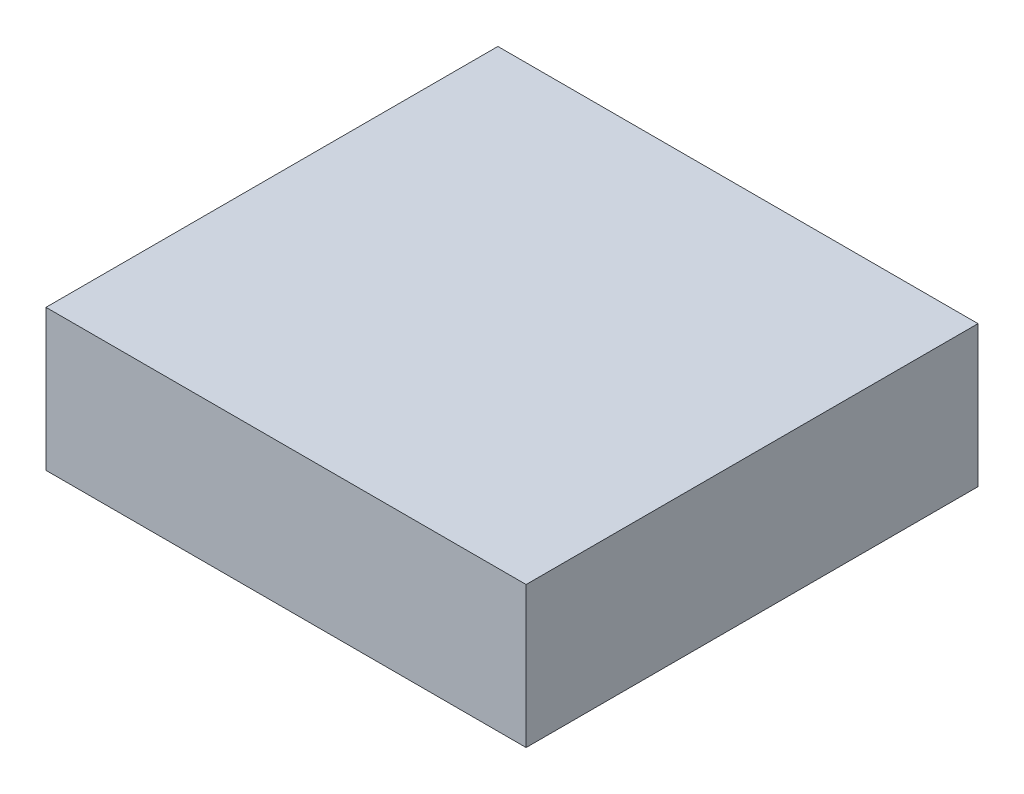
ISO-10303-21;
HEADER;
FILE_DESCRIPTION(('STEP AP214'),'2;1');
FILE_NAME('part.step','',(''),(''),'','','');
FILE_SCHEMA(('AUTOMOTIVE_DESIGN { 1 0 10303 214 1 1 1 1 }'));
ENDSEC;
DATA;
#1=APPLICATION_CONTEXT('core data for automotive mechanical design processes');
#2=APPLICATION_PROTOCOL_DEFINITION('international standard','automotive_design',2000,#1);
#3=PRODUCT_CONTEXT('',#1,'mechanical');
#4=PRODUCT('Part','Part','',(#3));
#5=PRODUCT_RELATED_PRODUCT_CATEGORY('part','',(#4));
#6=PRODUCT_DEFINITION_FORMATION('','',#4);
#7=PRODUCT_DEFINITION_CONTEXT('part definition',#1,'design');
#8=PRODUCT_DEFINITION('design','',#6,#7);
#9=PRODUCT_DEFINITION_SHAPE('','',#8);
#10=(LENGTH_UNIT() NAMED_UNIT(*) SI_UNIT(.MILLI.,.METRE.));
#11=(NAMED_UNIT(*) PLANE_ANGLE_UNIT() SI_UNIT($,.RADIAN.));
#12=(NAMED_UNIT(*) SI_UNIT($,.STERADIAN.) SOLID_ANGLE_UNIT());
#13=UNCERTAINTY_MEASURE_WITH_UNIT(LENGTH_MEASURE(1.E-05),#10,'distance_accuracy_value','');
#14=(GEOMETRIC_REPRESENTATION_CONTEXT(3) GLOBAL_UNCERTAINTY_ASSIGNED_CONTEXT((#13)) GLOBAL_UNIT_ASSIGNED_CONTEXT((#10,
#11,#12)) REPRESENTATION_CONTEXT('',''));
#15=CARTESIAN_POINT('',(0.,0.,0.));
#16=DIRECTION('',(0.,0.,1.));
#17=DIRECTION('',(1.,0.,0.));
#18=AXIS2_PLACEMENT_3D('',#15,#16,#17);
#19=CARTESIAN_POINT('',(8.5,5.,-8.));
#20=DIRECTION('',(-1.,0.,0.));
#21=DIRECTION('',(0.,0.,1.));
#22=AXIS2_PLACEMENT_3D('',#19,#20,#21);
#23=PLANE('',#22);
#24=DIRECTION('',(0.,0.,-1.));
#25=VECTOR('',#24,1.);
#26=CARTESIAN_POINT('',(8.5,0.,-8.));
#27=LINE('',#26,#25);
#28=CARTESIAN_POINT('',(8.5,0.,8.));
#29=VERTEX_POINT('',#28);
#30=CARTESIAN_POINT('',(8.5,0.,-8.));
#31=VERTEX_POINT('',#30);
#32=EDGE_CURVE('E96',#29,#31,#27,.T.);
#33=ORIENTED_EDGE('',*,*,#32,.T.);
#34=DIRECTION('',(0.,-1.,0.));
#35=VECTOR('',#34,1.);
#36=CARTESIAN_POINT('',(8.5,5.,-8.));
#37=LINE('',#36,#35);
#38=CARTESIAN_POINT('',(8.5,5.,-8.));
#39=VERTEX_POINT('',#38);
#40=EDGE_CURVE('E11',#39,#31,#37,.T.);
#41=ORIENTED_EDGE('',*,*,#40,.F.);
#42=DIRECTION('',(0.,0.,-1.));
#43=VECTOR('',#42,1.);
#44=CARTESIAN_POINT('',(8.5,5.,-8.));
#45=LINE('',#44,#43);
#46=CARTESIAN_POINT('',(8.5,5.,8.));
#47=VERTEX_POINT('',#46);
#48=EDGE_CURVE('E84',#47,#39,#45,.T.);
#49=ORIENTED_EDGE('',*,*,#48,.F.);
#50=DIRECTION('',(0.,-1.,0.));
#51=VECTOR('',#50,1.);
#52=CARTESIAN_POINT('',(8.5,5.,8.));
#53=LINE('',#52,#51);
#54=EDGE_CURVE('E92',#47,#29,#53,.T.);
#55=ORIENTED_EDGE('',*,*,#54,.T.);
#56=EDGE_LOOP('',(#33,#41,#49,#55));
#57=FACE_BOUND('',#56,.T.);
#58=ADVANCED_FACE('F33',(#57),#23,.F.);
#59=CARTESIAN_POINT('',(-8.5,5.,-8.));
#60=DIRECTION('',(0.,0.,1.));
#61=DIRECTION('',(1.,0.,0.));
#62=AXIS2_PLACEMENT_3D('',#59,#60,#61);
#63=PLANE('',#62);
#64=DIRECTION('',(-1.,0.,0.));
#65=VECTOR('',#64,1.);
#66=CARTESIAN_POINT('',(-8.5,0.,-8.));
#67=LINE('',#66,#65);
#68=CARTESIAN_POINT('',(-8.5,0.,-8.));
#69=VERTEX_POINT('',#68);
#70=EDGE_CURVE('E88',#31,#69,#67,.T.);
#71=ORIENTED_EDGE('',*,*,#70,.T.);
#72=DIRECTION('',(0.,-1.,0.));
#73=VECTOR('',#72,1.);
#74=CARTESIAN_POINT('',(-8.5,5.,-8.));
#75=LINE('',#74,#73);
#76=CARTESIAN_POINT('',(-8.5,5.,-8.));
#77=VERTEX_POINT('',#76);
#78=EDGE_CURVE('E41',#77,#69,#75,.T.);
#79=ORIENTED_EDGE('',*,*,#78,.F.);
#80=DIRECTION('',(-1.,0.,0.));
#81=VECTOR('',#80,1.);
#82=CARTESIAN_POINT('',(-8.5,5.,-8.));
#83=LINE('',#82,#81);
#84=EDGE_CURVE('E79',#39,#77,#83,.T.);
#85=ORIENTED_EDGE('',*,*,#84,.F.);
#86=ORIENTED_EDGE('',*,*,#40,.T.);
#87=EDGE_LOOP('',(#71,#79,#85,#86));
#88=FACE_BOUND('',#87,.T.);
#89=ADVANCED_FACE('F87',(#88),#63,.F.);
#90=CARTESIAN_POINT('',(-8.5,5.,-8.));
#91=DIRECTION('',(1.,0.,0.));
#92=DIRECTION('',(0.,0.,-1.));
#93=AXIS2_PLACEMENT_3D('',#90,#91,#92);
#94=PLANE('',#93);
#95=DIRECTION('',(0.,0.,1.));
#96=VECTOR('',#95,1.);
#97=CARTESIAN_POINT('',(-8.5,0.,-8.));
#98=LINE('',#97,#96);
#99=CARTESIAN_POINT('',(-8.5,0.,8.));
#100=VERTEX_POINT('',#99);
#101=EDGE_CURVE('E66',#69,#100,#98,.T.);
#102=ORIENTED_EDGE('',*,*,#101,.T.);
#103=DIRECTION('',(0.,-1.,0.));
#104=VECTOR('',#103,1.);
#105=CARTESIAN_POINT('',(-8.5,5.,8.));
#106=LINE('',#105,#104);
#107=CARTESIAN_POINT('',(-8.5,5.,8.));
#108=VERTEX_POINT('',#107);
#109=EDGE_CURVE('E89',#108,#100,#106,.T.);
#110=ORIENTED_EDGE('',*,*,#109,.F.);
#111=DIRECTION('',(0.,0.,1.));
#112=VECTOR('',#111,1.);
#113=CARTESIAN_POINT('',(-8.5,5.,-8.));
#114=LINE('',#113,#112);
#115=EDGE_CURVE('E82',#77,#108,#114,.T.);
#116=ORIENTED_EDGE('',*,*,#115,.F.);
#117=ORIENTED_EDGE('',*,*,#78,.T.);
#118=EDGE_LOOP('',(#102,#110,#116,#117));
#119=FACE_BOUND('',#118,.T.);
#120=ADVANCED_FACE('F90',(#119),#94,.F.);
#121=CARTESIAN_POINT('',(-8.5,5.,8.));
#122=DIRECTION('',(0.,0.,-1.));
#123=DIRECTION('',(-1.,0.,0.));
#124=AXIS2_PLACEMENT_3D('',#121,#122,#123);
#125=PLANE('',#124);
#126=DIRECTION('',(1.,0.,0.));
#127=VECTOR('',#126,1.);
#128=CARTESIAN_POINT('',(-8.5,0.,8.));
#129=LINE('',#128,#127);
#130=EDGE_CURVE('E72',#100,#29,#129,.T.);
#131=ORIENTED_EDGE('',*,*,#130,.T.);
#132=ORIENTED_EDGE('',*,*,#54,.F.);
#133=DIRECTION('',(1.,0.,0.));
#134=VECTOR('',#133,1.);
#135=CARTESIAN_POINT('',(-8.5,5.,8.));
#136=LINE('',#135,#134);
#137=EDGE_CURVE('E49',#108,#47,#136,.T.);
#138=ORIENTED_EDGE('',*,*,#137,.F.);
#139=ORIENTED_EDGE('',*,*,#109,.T.);
#140=EDGE_LOOP('',(#131,#132,#138,#139));
#141=FACE_BOUND('',#140,.T.);
#142=ADVANCED_FACE('F103',(#141),#125,.F.);
#143=CARTESIAN_POINT('',(0.,5.,0.));
#144=DIRECTION('',(0.,1.,0.));
#145=DIRECTION('',(0.,0.,1.));
#146=AXIS2_PLACEMENT_3D('',#143,#144,#145);
#147=PLANE('',#146);
#148=ORIENTED_EDGE('',*,*,#48,.T.);
#149=ORIENTED_EDGE('',*,*,#84,.T.);
#150=ORIENTED_EDGE('',*,*,#115,.T.);
#151=ORIENTED_EDGE('',*,*,#137,.T.);
#152=EDGE_LOOP('',(#148,#149,#150,#151));
#153=FACE_BOUND('',#152,.T.);
#154=ADVANCED_FACE('F80',(#153),#147,.T.);
#155=CARTESIAN_POINT('',(0.,0.,0.));
#156=DIRECTION('',(0.,1.,0.));
#157=DIRECTION('',(0.,0.,1.));
#158=AXIS2_PLACEMENT_3D('',#155,#156,#157);
#159=PLANE('',#158);
#160=ORIENTED_EDGE('',*,*,#32,.F.);
#161=ORIENTED_EDGE('',*,*,#130,.F.);
#162=ORIENTED_EDGE('',*,*,#101,.F.);
#163=ORIENTED_EDGE('',*,*,#70,.F.);
#164=EDGE_LOOP('',(#160,#161,#162,#163));
#165=FACE_BOUND('',#164,.T.);
#166=ADVANCED_FACE('F106',(#165),#159,.F.);
#167=CLOSED_SHELL('',(#58,#89,#120,#142,#154,#166));
#168=MANIFOLD_SOLID_BREP('B2',#167);
#169=ADVANCED_BREP_SHAPE_REPRESENTATION('',(#18,#168),#14);
#170=SHAPE_DEFINITION_REPRESENTATION(#9,#169);
ENDSEC;
END-ISO-10303-21;
